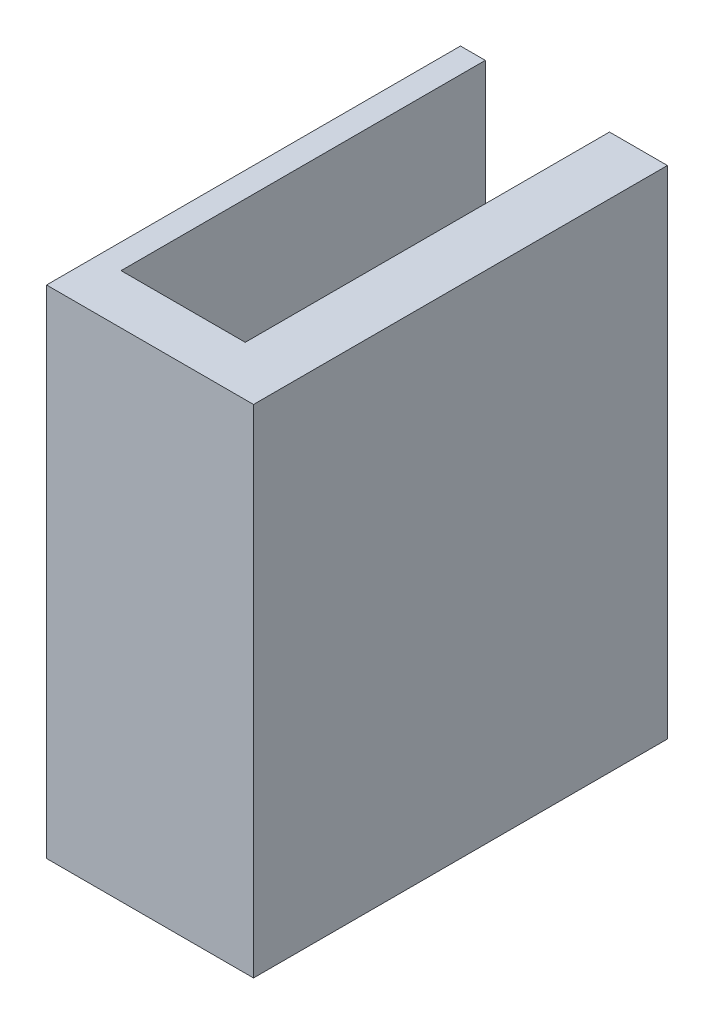
ISO-10303-21;
HEADER;
FILE_DESCRIPTION(('STEP AP214'),'2;1');
FILE_NAME('part.step','',(''),(''),'','','');
FILE_SCHEMA(('AUTOMOTIVE_DESIGN { 1 0 10303 214 1 1 1 1 }'));
ENDSEC;
DATA;
#1=APPLICATION_CONTEXT('core data for automotive mechanical design processes');
#2=APPLICATION_PROTOCOL_DEFINITION('international standard','automotive_design',2000,#1);
#3=PRODUCT_CONTEXT('',#1,'mechanical');
#4=PRODUCT('Part','Part','',(#3));
#5=PRODUCT_RELATED_PRODUCT_CATEGORY('part','',(#4));
#6=PRODUCT_DEFINITION_FORMATION('','',#4);
#7=PRODUCT_DEFINITION_CONTEXT('part definition',#1,'design');
#8=PRODUCT_DEFINITION('design','',#6,#7);
#9=PRODUCT_DEFINITION_SHAPE('','',#8);
#10=(LENGTH_UNIT() NAMED_UNIT(*) SI_UNIT(.MILLI.,.METRE.));
#11=(NAMED_UNIT(*) PLANE_ANGLE_UNIT() SI_UNIT($,.RADIAN.));
#12=(NAMED_UNIT(*) SI_UNIT($,.STERADIAN.) SOLID_ANGLE_UNIT());
#13=UNCERTAINTY_MEASURE_WITH_UNIT(LENGTH_MEASURE(1.E-05),#10,'distance_accuracy_value','');
#14=(GEOMETRIC_REPRESENTATION_CONTEXT(3) GLOBAL_UNCERTAINTY_ASSIGNED_CONTEXT((#13)) GLOBAL_UNIT_ASSIGNED_CONTEXT((#10,
#11,#12)) REPRESENTATION_CONTEXT('',''));
#15=CARTESIAN_POINT('',(0.,0.,0.));
#16=DIRECTION('',(0.,0.,1.));
#17=DIRECTION('',(1.,0.,0.));
#18=AXIS2_PLACEMENT_3D('',#15,#16,#17);
#19=CARTESIAN_POINT('',(12.5,60.,-25.));
#20=DIRECTION('',(-1.,0.,0.));
#21=DIRECTION('',(0.,0.,1.));
#22=AXIS2_PLACEMENT_3D('',#19,#20,#21);
#23=PLANE('',#22);
#24=DIRECTION('',(0.,0.,-1.));
#25=VECTOR('',#24,1.);
#26=CARTESIAN_POINT('',(12.5,0.,-25.));
#27=LINE('',#26,#25);
#28=CARTESIAN_POINT('',(12.5,0.,25.));
#29=VERTEX_POINT('',#28);
#30=CARTESIAN_POINT('',(12.5,0.,-25.));
#31=VERTEX_POINT('',#30);
#32=EDGE_CURVE('E140',#29,#31,#27,.T.);
#33=ORIENTED_EDGE('',*,*,#32,.T.);
#34=DIRECTION('',(0.,-1.,0.));
#35=VECTOR('',#34,1.);
#36=CARTESIAN_POINT('',(12.5,60.,-25.));
#37=LINE('',#36,#35);
#38=CARTESIAN_POINT('',(12.5,60.,-25.));
#39=VERTEX_POINT('',#38);
#40=EDGE_CURVE('E11',#39,#31,#37,.T.);
#41=ORIENTED_EDGE('',*,*,#40,.F.);
#42=DIRECTION('',(0.,0.,-1.));
#43=VECTOR('',#42,1.);
#44=CARTESIAN_POINT('',(12.5,60.,-25.));
#45=LINE('',#44,#43);
#46=CARTESIAN_POINT('',(12.5,60.,25.));
#47=VERTEX_POINT('',#46);
#48=EDGE_CURVE('E162',#47,#39,#45,.T.);
#49=ORIENTED_EDGE('',*,*,#48,.F.);
#50=DIRECTION('',(0.,-1.,0.));
#51=VECTOR('',#50,1.);
#52=CARTESIAN_POINT('',(12.5,60.,25.));
#53=LINE('',#52,#51);
#54=EDGE_CURVE('E136',#47,#29,#53,.T.);
#55=ORIENTED_EDGE('',*,*,#54,.T.);
#56=EDGE_LOOP('',(#33,#41,#49,#55));
#57=FACE_BOUND('',#56,.T.);
#58=ADVANCED_FACE('F39',(#57),#23,.F.);
#59=CARTESIAN_POINT('',(5.5,60.,-25.));
#60=DIRECTION('',(0.,0.,1.));
#61=DIRECTION('',(1.,0.,0.));
#62=AXIS2_PLACEMENT_3D('',#59,#60,#61);
#63=PLANE('',#62);
#64=DIRECTION('',(-1.,0.,0.));
#65=VECTOR('',#64,1.);
#66=CARTESIAN_POINT('',(5.5,0.,-25.));
#67=LINE('',#66,#65);
#68=CARTESIAN_POINT('',(5.5,0.,-25.));
#69=VERTEX_POINT('',#68);
#70=EDGE_CURVE('E144',#31,#69,#67,.T.);
#71=ORIENTED_EDGE('',*,*,#70,.T.);
#72=DIRECTION('',(0.,-1.,0.));
#73=VECTOR('',#72,1.);
#74=CARTESIAN_POINT('',(5.5,60.,-25.));
#75=LINE('',#74,#73);
#76=CARTESIAN_POINT('',(5.5,60.,-25.));
#77=VERTEX_POINT('',#76);
#78=EDGE_CURVE('E48',#77,#69,#75,.T.);
#79=ORIENTED_EDGE('',*,*,#78,.F.);
#80=DIRECTION('',(-1.,0.,0.));
#81=VECTOR('',#80,1.);
#82=CARTESIAN_POINT('',(5.5,60.,-25.));
#83=LINE('',#82,#81);
#84=EDGE_CURVE('E99',#39,#77,#83,.T.);
#85=ORIENTED_EDGE('',*,*,#84,.F.);
#86=ORIENTED_EDGE('',*,*,#40,.T.);
#87=EDGE_LOOP('',(#71,#79,#85,#86));
#88=FACE_BOUND('',#87,.T.);
#89=ADVANCED_FACE('F208',(#88),#63,.F.);
#90=CARTESIAN_POINT('',(5.5,60.,19.));
#91=DIRECTION('',(1.,0.,0.));
#92=DIRECTION('',(0.,0.,-1.));
#93=AXIS2_PLACEMENT_3D('',#90,#91,#92);
#94=PLANE('',#93);
#95=DIRECTION('',(0.,0.,1.));
#96=VECTOR('',#95,1.);
#97=CARTESIAN_POINT('',(5.5,0.,19.));
#98=LINE('',#97,#96);
#99=CARTESIAN_POINT('',(5.5,0.,19.));
#100=VERTEX_POINT('',#99);
#101=EDGE_CURVE('E147',#69,#100,#98,.T.);
#102=ORIENTED_EDGE('',*,*,#101,.T.);
#103=DIRECTION('',(0.,-1.,0.));
#104=VECTOR('',#103,1.);
#105=CARTESIAN_POINT('',(5.5,60.,19.));
#106=LINE('',#105,#104);
#107=CARTESIAN_POINT('',(5.5,60.,19.));
#108=VERTEX_POINT('',#107);
#109=EDGE_CURVE('E173',#108,#100,#106,.T.);
#110=ORIENTED_EDGE('',*,*,#109,.F.);
#111=DIRECTION('',(0.,0.,1.));
#112=VECTOR('',#111,1.);
#113=CARTESIAN_POINT('',(5.5,60.,19.));
#114=LINE('',#113,#112);
#115=EDGE_CURVE('E183',#77,#108,#114,.T.);
#116=ORIENTED_EDGE('',*,*,#115,.F.);
#117=ORIENTED_EDGE('',*,*,#78,.T.);
#118=EDGE_LOOP('',(#102,#110,#116,#117));
#119=FACE_BOUND('',#118,.T.);
#120=ADVANCED_FACE('F181',(#119),#94,.F.);
#121=CARTESIAN_POINT('',(-9.5,60.,19.));
#122=DIRECTION('',(0.,0.,1.));
#123=DIRECTION('',(1.,0.,0.));
#124=AXIS2_PLACEMENT_3D('',#121,#122,#123);
#125=PLANE('',#124);
#126=DIRECTION('',(-1.,0.,0.));
#127=VECTOR('',#126,1.);
#128=CARTESIAN_POINT('',(-9.5,0.,19.));
#129=LINE('',#128,#127);
#130=CARTESIAN_POINT('',(-9.5,0.,19.));
#131=VERTEX_POINT('',#130);
#132=EDGE_CURVE('E150',#100,#131,#129,.T.);
#133=ORIENTED_EDGE('',*,*,#132,.T.);
#134=DIRECTION('',(0.,-1.,0.));
#135=VECTOR('',#134,1.);
#136=CARTESIAN_POINT('',(-9.5,60.,19.));
#137=LINE('',#136,#135);
#138=CARTESIAN_POINT('',(-9.5,60.,19.));
#139=VERTEX_POINT('',#138);
#140=EDGE_CURVE('E169',#139,#131,#137,.T.);
#141=ORIENTED_EDGE('',*,*,#140,.F.);
#142=DIRECTION('',(-1.,0.,0.));
#143=VECTOR('',#142,1.);
#144=CARTESIAN_POINT('',(-9.5,60.,19.));
#145=LINE('',#144,#143);
#146=EDGE_CURVE('E196',#108,#139,#145,.T.);
#147=ORIENTED_EDGE('',*,*,#146,.F.);
#148=ORIENTED_EDGE('',*,*,#109,.T.);
#149=EDGE_LOOP('',(#133,#141,#147,#148));
#150=FACE_BOUND('',#149,.T.);
#151=ADVANCED_FACE('F191',(#150),#125,.F.);
#152=CARTESIAN_POINT('',(-9.50000000000001,60.,-25.));
#153=DIRECTION('',(-1.,0.,0.));
#154=DIRECTION('',(0.,0.,1.));
#155=AXIS2_PLACEMENT_3D('',#152,#153,#154);
#156=PLANE('',#155);
#157=DIRECTION('',(0.,0.,-1.));
#158=VECTOR('',#157,1.);
#159=CARTESIAN_POINT('',(-9.50000000000001,0.,-25.));
#160=LINE('',#159,#158);
#161=CARTESIAN_POINT('',(-9.50000000000001,0.,-25.));
#162=VERTEX_POINT('',#161);
#163=EDGE_CURVE('E153',#131,#162,#160,.T.);
#164=ORIENTED_EDGE('',*,*,#163,.T.);
#165=DIRECTION('',(0.,-1.,0.));
#166=VECTOR('',#165,1.);
#167=CARTESIAN_POINT('',(-9.50000000000001,60.,-25.));
#168=LINE('',#167,#166);
#169=CARTESIAN_POINT('',(-9.50000000000001,60.,-25.));
#170=VERTEX_POINT('',#169);
#171=EDGE_CURVE('E129',#170,#162,#168,.T.);
#172=ORIENTED_EDGE('',*,*,#171,.F.);
#173=DIRECTION('',(0.,0.,-1.));
#174=VECTOR('',#173,1.);
#175=CARTESIAN_POINT('',(-9.50000000000001,60.,-25.));
#176=LINE('',#175,#174);
#177=EDGE_CURVE('E118',#139,#170,#176,.T.);
#178=ORIENTED_EDGE('',*,*,#177,.F.);
#179=ORIENTED_EDGE('',*,*,#140,.T.);
#180=EDGE_LOOP('',(#164,#172,#178,#179));
#181=FACE_BOUND('',#180,.T.);
#182=ADVANCED_FACE('F194',(#181),#156,.F.);
#183=CARTESIAN_POINT('',(-12.5,60.,-25.));
#184=DIRECTION('',(0.,0.,1.));
#185=DIRECTION('',(1.,0.,0.));
#186=AXIS2_PLACEMENT_3D('',#183,#184,#185);
#187=PLANE('',#186);
#188=DIRECTION('',(-1.,0.,0.));
#189=VECTOR('',#188,1.);
#190=CARTESIAN_POINT('',(-12.5,0.,-25.));
#191=LINE('',#190,#189);
#192=CARTESIAN_POINT('',(-12.5,0.,-25.));
#193=VERTEX_POINT('',#192);
#194=EDGE_CURVE('E127',#162,#193,#191,.T.);
#195=ORIENTED_EDGE('',*,*,#194,.T.);
#196=DIRECTION('',(0.,-1.,0.));
#197=VECTOR('',#196,1.);
#198=CARTESIAN_POINT('',(-12.5,60.,-25.));
#199=LINE('',#198,#197);
#200=CARTESIAN_POINT('',(-12.5,60.,-25.));
#201=VERTEX_POINT('',#200);
#202=EDGE_CURVE('E124',#201,#193,#199,.T.);
#203=ORIENTED_EDGE('',*,*,#202,.F.);
#204=DIRECTION('',(-1.,0.,0.));
#205=VECTOR('',#204,1.);
#206=CARTESIAN_POINT('',(-12.5,60.,-25.));
#207=LINE('',#206,#205);
#208=EDGE_CURVE('E112',#170,#201,#207,.T.);
#209=ORIENTED_EDGE('',*,*,#208,.F.);
#210=ORIENTED_EDGE('',*,*,#171,.T.);
#211=EDGE_LOOP('',(#195,#203,#209,#210));
#212=FACE_BOUND('',#211,.T.);
#213=ADVANCED_FACE('F125',(#212),#187,.F.);
#214=CARTESIAN_POINT('',(-12.5,60.,-25.));
#215=DIRECTION('',(1.,0.,0.));
#216=DIRECTION('',(0.,0.,-1.));
#217=AXIS2_PLACEMENT_3D('',#214,#215,#216);
#218=PLANE('',#217);
#219=DIRECTION('',(0.,0.,1.));
#220=VECTOR('',#219,1.);
#221=CARTESIAN_POINT('',(-12.5,0.,-25.));
#222=LINE('',#221,#220);
#223=CARTESIAN_POINT('',(-12.5,0.,25.));
#224=VERTEX_POINT('',#223);
#225=EDGE_CURVE('E85',#193,#224,#222,.T.);
#226=ORIENTED_EDGE('',*,*,#225,.T.);
#227=DIRECTION('',(0.,-1.,0.));
#228=VECTOR('',#227,1.);
#229=CARTESIAN_POINT('',(-12.5,60.,25.));
#230=LINE('',#229,#228);
#231=CARTESIAN_POINT('',(-12.5,60.,25.));
#232=VERTEX_POINT('',#231);
#233=EDGE_CURVE('E130',#232,#224,#230,.T.);
#234=ORIENTED_EDGE('',*,*,#233,.F.);
#235=DIRECTION('',(0.,0.,1.));
#236=VECTOR('',#235,1.);
#237=CARTESIAN_POINT('',(-12.5,60.,-25.));
#238=LINE('',#237,#236);
#239=EDGE_CURVE('E116',#201,#232,#238,.T.);
#240=ORIENTED_EDGE('',*,*,#239,.F.);
#241=ORIENTED_EDGE('',*,*,#202,.T.);
#242=EDGE_LOOP('',(#226,#234,#240,#241));
#243=FACE_BOUND('',#242,.T.);
#244=ADVANCED_FACE('F132',(#243),#218,.F.);
#245=CARTESIAN_POINT('',(-12.5,60.,25.));
#246=DIRECTION('',(0.,0.,-1.));
#247=DIRECTION('',(-1.,0.,0.));
#248=AXIS2_PLACEMENT_3D('',#245,#246,#247);
#249=PLANE('',#248);
#250=DIRECTION('',(1.,0.,0.));
#251=VECTOR('',#250,1.);
#252=CARTESIAN_POINT('',(-12.5,0.,25.));
#253=LINE('',#252,#251);
#254=EDGE_CURVE('E91',#224,#29,#253,.T.);
#255=ORIENTED_EDGE('',*,*,#254,.T.);
#256=ORIENTED_EDGE('',*,*,#54,.F.);
#257=DIRECTION('',(1.,0.,0.));
#258=VECTOR('',#257,1.);
#259=CARTESIAN_POINT('',(-12.5,60.,25.));
#260=LINE('',#259,#258);
#261=EDGE_CURVE('E56',#232,#47,#260,.T.);
#262=ORIENTED_EDGE('',*,*,#261,.F.);
#263=ORIENTED_EDGE('',*,*,#233,.T.);
#264=EDGE_LOOP('',(#255,#256,#262,#263));
#265=FACE_BOUND('',#264,.T.);
#266=ADVANCED_FACE('F224',(#265),#249,.F.);
#267=CARTESIAN_POINT('',(0.,60.,0.));
#268=DIRECTION('',(0.,1.,0.));
#269=DIRECTION('',(0.,0.,1.));
#270=AXIS2_PLACEMENT_3D('',#267,#268,#269);
#271=PLANE('',#270);
#272=ORIENTED_EDGE('',*,*,#48,.T.);
#273=ORIENTED_EDGE('',*,*,#84,.T.);
#274=ORIENTED_EDGE('',*,*,#115,.T.);
#275=ORIENTED_EDGE('',*,*,#146,.T.);
#276=ORIENTED_EDGE('',*,*,#177,.T.);
#277=ORIENTED_EDGE('',*,*,#208,.T.);
#278=ORIENTED_EDGE('',*,*,#239,.T.);
#279=ORIENTED_EDGE('',*,*,#261,.T.);
#280=EDGE_LOOP('',(#272,#273,#274,#275,#276,#277,#278,#279));
#281=FACE_BOUND('',#280,.T.);
#282=ADVANCED_FACE('F114',(#281),#271,.T.);
#283=CARTESIAN_POINT('',(0.,0.,0.));
#284=DIRECTION('',(0.,1.,0.));
#285=DIRECTION('',(0.,0.,1.));
#286=AXIS2_PLACEMENT_3D('',#283,#284,#285);
#287=PLANE('',#286);
#288=ORIENTED_EDGE('',*,*,#32,.F.);
#289=ORIENTED_EDGE('',*,*,#254,.F.);
#290=ORIENTED_EDGE('',*,*,#225,.F.);
#291=ORIENTED_EDGE('',*,*,#194,.F.);
#292=ORIENTED_EDGE('',*,*,#163,.F.);
#293=ORIENTED_EDGE('',*,*,#132,.F.);
#294=ORIENTED_EDGE('',*,*,#101,.F.);
#295=ORIENTED_EDGE('',*,*,#70,.F.);
#296=EDGE_LOOP('',(#288,#289,#290,#291,#292,#293,#294,#295));
#297=FACE_BOUND('',#296,.T.);
#298=ADVANCED_FACE('F187',(#297),#287,.F.);
#299=CLOSED_SHELL('',(#58,#89,#120,#151,#182,#213,#244,#266,#282,#298));
#300=MANIFOLD_SOLID_BREP('B2',#299);
#301=ADVANCED_BREP_SHAPE_REPRESENTATION('',(#18,#300),#14);
#302=SHAPE_DEFINITION_REPRESENTATION(#9,#301);
ENDSEC;
END-ISO-10303-21;
